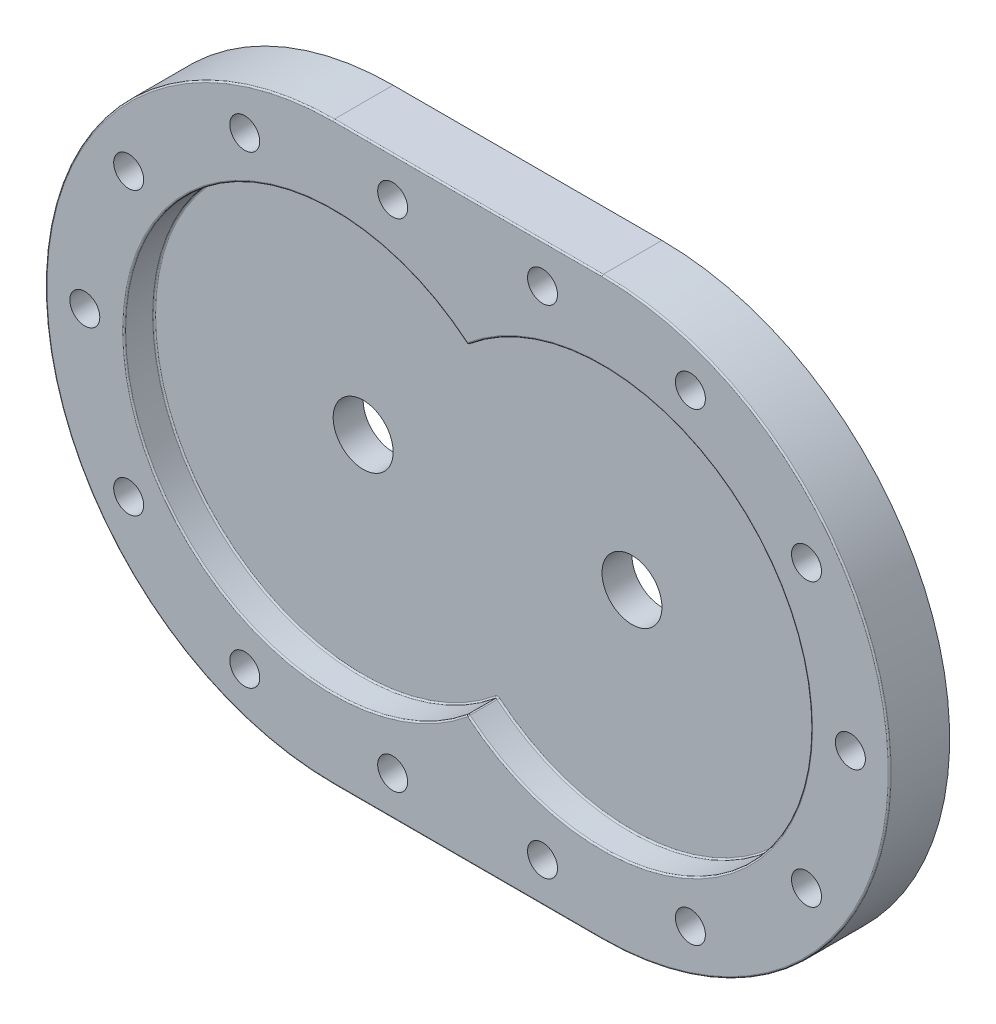
ISO-10303-21;
HEADER;
FILE_DESCRIPTION(('STEP AP214'),'2;1');
FILE_NAME('part.step','',(''),(''),'','','');
FILE_SCHEMA(('AUTOMOTIVE_DESIGN { 1 0 10303 214 1 1 1 1 }'));
ENDSEC;
DATA;
#1=APPLICATION_CONTEXT('core data for automotive mechanical design processes');
#2=APPLICATION_PROTOCOL_DEFINITION('international standard','automotive_design',2000,#1);
#3=PRODUCT_CONTEXT('',#1,'mechanical');
#4=PRODUCT('Part','Part','',(#3));
#5=PRODUCT_RELATED_PRODUCT_CATEGORY('part','',(#4));
#6=PRODUCT_DEFINITION_FORMATION('','',#4);
#7=PRODUCT_DEFINITION_CONTEXT('part definition',#1,'design');
#8=PRODUCT_DEFINITION('design','',#6,#7);
#9=PRODUCT_DEFINITION_SHAPE('','',#8);
#10=(LENGTH_UNIT() NAMED_UNIT(*) SI_UNIT(.MILLI.,.METRE.));
#11=(NAMED_UNIT(*) PLANE_ANGLE_UNIT() SI_UNIT($,.RADIAN.));
#12=(NAMED_UNIT(*) SI_UNIT($,.STERADIAN.) SOLID_ANGLE_UNIT());
#13=UNCERTAINTY_MEASURE_WITH_UNIT(LENGTH_MEASURE(1.E-05),#10,'distance_accuracy_value','');
#14=(GEOMETRIC_REPRESENTATION_CONTEXT(3) GLOBAL_UNCERTAINTY_ASSIGNED_CONTEXT((#13)) GLOBAL_UNIT_ASSIGNED_CONTEXT((#10,
#11,#12)) REPRESENTATION_CONTEXT('',''));
#15=CARTESIAN_POINT('',(0.,0.,0.));
#16=DIRECTION('',(0.,0.,1.));
#17=DIRECTION('',(1.,0.,0.));
#18=AXIS2_PLACEMENT_3D('',#15,#16,#17);
#19=CARTESIAN_POINT('',(0.,-96.,20.));
#20=DIRECTION('',(0.,1.,0.));
#21=DIRECTION('',(-1.,0.,0.));
#22=AXIS2_PLACEMENT_3D('',#19,#20,#21);
#23=PLANE('',#22);
#24=DIRECTION('',(0.,0.,-1.));
#25=VECTOR('',#24,1.);
#26=CARTESIAN_POINT('',(44.845,-96.,20.));
#27=LINE('',#26,#25);
#28=CARTESIAN_POINT('',(44.845,-96.,19.5));
#29=VERTEX_POINT('',#28);
#30=CARTESIAN_POINT('',(44.845,-96.,0.));
#31=VERTEX_POINT('',#30);
#32=EDGE_CURVE('E163',#29,#31,#27,.T.);
#33=ORIENTED_EDGE('',*,*,#32,.F.);
#34=DIRECTION('',(1.,0.,0.));
#35=VECTOR('',#34,1.);
#36=CARTESIAN_POINT('',(-44.845,-96.,19.5));
#37=LINE('',#36,#35);
#38=CARTESIAN_POINT('',(-44.845,-96.,19.5));
#39=VERTEX_POINT('',#38);
#40=EDGE_CURVE('E218',#29,#39,#37,.F.);
#41=ORIENTED_EDGE('',*,*,#40,.T.);
#42=DIRECTION('',(0.,0.,-1.));
#43=VECTOR('',#42,1.);
#44=CARTESIAN_POINT('',(-44.845,-96.,20.));
#45=LINE('',#44,#43);
#46=CARTESIAN_POINT('',(-44.845,-96.,0.));
#47=VERTEX_POINT('',#46);
#48=EDGE_CURVE('E187',#39,#47,#45,.T.);
#49=ORIENTED_EDGE('',*,*,#48,.T.);
#50=DIRECTION('',(1.,0.,0.));
#51=VECTOR('',#50,1.);
#52=CARTESIAN_POINT('',(0.,-96.,0.));
#53=LINE('',#52,#51);
#54=EDGE_CURVE('E182',#47,#31,#53,.T.);
#55=ORIENTED_EDGE('',*,*,#54,.T.);
#56=EDGE_LOOP('',(#33,#41,#49,#55));
#57=FACE_BOUND('',#56,.T.);
#58=ADVANCED_FACE('F68',(#57),#23,.F.);
#59=CARTESIAN_POINT('',(44.845,0.,20.));
#60=DIRECTION('',(0.,0.,-1.));
#61=DIRECTION('',(-1.,0.,0.));
#62=AXIS2_PLACEMENT_3D('',#59,#60,#61);
#63=CYLINDRICAL_SURFACE('',#62,96.);
#64=DIRECTION('',(0.,0.,-1.));
#65=VECTOR('',#64,1.);
#66=CARTESIAN_POINT('',(44.845,96.,20.));
#67=LINE('',#66,#65);
#68=CARTESIAN_POINT('',(44.845,96.,19.5));
#69=VERTEX_POINT('',#68);
#70=CARTESIAN_POINT('',(44.845,96.,0.));
#71=VERTEX_POINT('',#70);
#72=EDGE_CURVE('E175',#69,#71,#67,.T.);
#73=ORIENTED_EDGE('',*,*,#72,.F.);
#74=CARTESIAN_POINT('',(44.845,0.,19.5));
#75=DIRECTION('',(0.,0.,1.));
#76=DIRECTION('',(1.,0.,0.));
#77=AXIS2_PLACEMENT_3D('',#74,#75,#76);
#78=CIRCLE('',#77,96.);
#79=EDGE_CURVE('E13',#69,#29,#78,.F.);
#80=ORIENTED_EDGE('',*,*,#79,.T.);
#81=ORIENTED_EDGE('',*,*,#32,.T.);
#82=CARTESIAN_POINT('',(44.845,0.,0.));
#83=DIRECTION('',(0.,0.,1.));
#84=DIRECTION('',(1.,0.,0.));
#85=AXIS2_PLACEMENT_3D('',#82,#83,#84);
#86=CIRCLE('',#85,96.);
#87=EDGE_CURVE('E167',#31,#71,#86,.T.);
#88=ORIENTED_EDGE('',*,*,#87,.T.);
#89=EDGE_LOOP('',(#73,#80,#81,#88));
#90=FACE_BOUND('',#89,.T.);
#91=ADVANCED_FACE('F166',(#90),#63,.T.);
#92=CARTESIAN_POINT('',(0.,96.,20.));
#93=DIRECTION('',(0.,1.,0.));
#94=DIRECTION('',(-1.,0.,0.));
#95=AXIS2_PLACEMENT_3D('',#92,#93,#94);
#96=PLANE('',#95);
#97=DIRECTION('',(0.,0.,-1.));
#98=VECTOR('',#97,1.);
#99=CARTESIAN_POINT('',(-44.845,96.,20.));
#100=LINE('',#99,#98);
#101=CARTESIAN_POINT('',(-44.845,96.,19.5));
#102=VERTEX_POINT('',#101);
#103=CARTESIAN_POINT('',(-44.845,96.,0.));
#104=VERTEX_POINT('',#103);
#105=EDGE_CURVE('E202',#102,#104,#100,.T.);
#106=ORIENTED_EDGE('',*,*,#105,.F.);
#107=DIRECTION('',(1.,0.,0.));
#108=VECTOR('',#107,1.);
#109=CARTESIAN_POINT('',(0.,96.,19.5));
#110=LINE('',#109,#108);
#111=EDGE_CURVE('E222',#102,#69,#110,.T.);
#112=ORIENTED_EDGE('',*,*,#111,.T.);
#113=ORIENTED_EDGE('',*,*,#72,.T.);
#114=DIRECTION('',(1.,0.,0.));
#115=VECTOR('',#114,1.);
#116=CARTESIAN_POINT('',(0.,96.,0.));
#117=LINE('',#116,#115);
#118=EDGE_CURVE('E184',#104,#71,#117,.T.);
#119=ORIENTED_EDGE('',*,*,#118,.F.);
#120=EDGE_LOOP('',(#106,#112,#113,#119));
#121=FACE_BOUND('',#120,.T.);
#122=ADVANCED_FACE('F435',(#121),#96,.T.);
#123=CARTESIAN_POINT('',(44.845,0.,20.));
#124=DIRECTION('',(0.,0.,-1.));
#125=DIRECTION('',(-1.,0.,0.));
#126=AXIS2_PLACEMENT_3D('',#123,#124,#125);
#127=CYLINDRICAL_SURFACE('',#126,69.75);
#128=CARTESIAN_POINT('',(44.845,0.,10.5));
#129=DIRECTION('',(0.,0.,1.));
#130=DIRECTION('',(1.,0.,0.));
#131=AXIS2_PLACEMENT_3D('',#128,#129,#130);
#132=CIRCLE('',#131,69.75);
#133=CARTESIAN_POINT('',(0.319181494661918,53.6890490363696,10.5));
#134=VERTEX_POINT('',#133);
#135=CARTESIAN_POINT('',(0.319181494661919,-53.6890490363696,10.5));
#136=VERTEX_POINT('',#135);
#137=EDGE_CURVE('E226',#134,#136,#132,.F.);
#138=ORIENTED_EDGE('',*,*,#137,.T.);
#139=DIRECTION('',(0.,0.,-1.));
#140=VECTOR('',#139,1.);
#141=CARTESIAN_POINT('',(0.319181494661917,-53.6890490363695,20.));
#142=LINE('',#141,#140);
#143=CARTESIAN_POINT('',(0.319181494661919,-53.6890490363696,19.5));
#144=VERTEX_POINT('',#143);
#145=EDGE_CURVE('E231',#136,#144,#142,.F.);
#146=ORIENTED_EDGE('',*,*,#145,.T.);
#147=CARTESIAN_POINT('',(44.845,0.,19.5));
#148=DIRECTION('',(0.,0.,1.));
#149=DIRECTION('',(1.,0.,0.));
#150=AXIS2_PLACEMENT_3D('',#147,#148,#149);
#151=CIRCLE('',#150,69.75);
#152=CARTESIAN_POINT('',(0.319181494661918,53.6890490363696,19.5));
#153=VERTEX_POINT('',#152);
#154=EDGE_CURVE('E228',#144,#153,#151,.T.);
#155=ORIENTED_EDGE('',*,*,#154,.T.);
#156=DIRECTION('',(0.,0.,-1.));
#157=VECTOR('',#156,1.);
#158=CARTESIAN_POINT('',(0.319181494661917,53.6890490363695,20.));
#159=LINE('',#158,#157);
#160=EDGE_CURVE('E224',#153,#134,#159,.T.);
#161=ORIENTED_EDGE('',*,*,#160,.T.);
#162=EDGE_LOOP('',(#138,#146,#155,#161));
#163=FACE_BOUND('',#162,.T.);
#164=ADVANCED_FACE('F319',(#163),#127,.F.);
#165=CARTESIAN_POINT('',(-44.845,0.,20.));
#166=DIRECTION('',(0.,0.,-1.));
#167=DIRECTION('',(-1.,0.,0.));
#168=AXIS2_PLACEMENT_3D('',#165,#166,#167);
#169=CYLINDRICAL_SURFACE('',#168,69.75);
#170=CARTESIAN_POINT('',(-44.845,0.,19.5));
#171=DIRECTION('',(0.,0.,1.));
#172=DIRECTION('',(1.,0.,0.));
#173=AXIS2_PLACEMENT_3D('',#170,#171,#172);
#174=CIRCLE('',#173,69.75);
#175=CARTESIAN_POINT('',(-0.319181494661918,53.6890490363696,19.5));
#176=VERTEX_POINT('',#175);
#177=CARTESIAN_POINT('',(-0.319181494661922,-53.6890490363695,19.5));
#178=VERTEX_POINT('',#177);
#179=EDGE_CURVE('E85',#176,#178,#174,.T.);
#180=ORIENTED_EDGE('',*,*,#179,.T.);
#181=DIRECTION('',(0.,0.,-1.));
#182=VECTOR('',#181,1.);
#183=CARTESIAN_POINT('',(-0.319181494661917,-53.6890490363695,20.));
#184=LINE('',#183,#182);
#185=CARTESIAN_POINT('',(-0.319181494661922,-53.6890490363695,10.5));
#186=VERTEX_POINT('',#185);
#187=EDGE_CURVE('E77',#178,#186,#184,.T.);
#188=ORIENTED_EDGE('',*,*,#187,.T.);
#189=CARTESIAN_POINT('',(-44.845,0.,10.5));
#190=DIRECTION('',(0.,0.,1.));
#191=DIRECTION('',(1.,0.,0.));
#192=AXIS2_PLACEMENT_3D('',#189,#190,#191);
#193=CIRCLE('',#192,69.75);
#194=CARTESIAN_POINT('',(-0.319181494661918,53.6890490363696,10.5));
#195=VERTEX_POINT('',#194);
#196=EDGE_CURVE('E243',#186,#195,#193,.F.);
#197=ORIENTED_EDGE('',*,*,#196,.T.);
#198=DIRECTION('',(0.,0.,-1.));
#199=VECTOR('',#198,1.);
#200=CARTESIAN_POINT('',(-0.319181494661917,53.6890490363695,20.));
#201=LINE('',#200,#199);
#202=EDGE_CURVE('E90',#195,#176,#201,.F.);
#203=ORIENTED_EDGE('',*,*,#202,.T.);
#204=EDGE_LOOP('',(#180,#188,#197,#203));
#205=FACE_BOUND('',#204,.T.);
#206=ADVANCED_FACE('F300',(#205),#169,.F.);
#207=CARTESIAN_POINT('',(-44.845,0.,20.));
#208=DIRECTION('',(0.,0.,-1.));
#209=DIRECTION('',(-1.,0.,0.));
#210=AXIS2_PLACEMENT_3D('',#207,#208,#209);
#211=CYLINDRICAL_SURFACE('',#210,96.);
#212=ORIENTED_EDGE('',*,*,#48,.F.);
#213=CARTESIAN_POINT('',(-44.845,0.,19.5));
#214=DIRECTION('',(0.,0.,1.));
#215=DIRECTION('',(1.,0.,0.));
#216=AXIS2_PLACEMENT_3D('',#213,#214,#215);
#217=CIRCLE('',#216,96.);
#218=EDGE_CURVE('E220',#39,#102,#217,.F.);
#219=ORIENTED_EDGE('',*,*,#218,.T.);
#220=ORIENTED_EDGE('',*,*,#105,.T.);
#221=CARTESIAN_POINT('',(-44.845,0.,0.));
#222=DIRECTION('',(0.,0.,1.));
#223=DIRECTION('',(1.,0.,0.));
#224=AXIS2_PLACEMENT_3D('',#221,#222,#223);
#225=CIRCLE('',#224,96.);
#226=EDGE_CURVE('E199',#104,#47,#225,.T.);
#227=ORIENTED_EDGE('',*,*,#226,.T.);
#228=EDGE_LOOP('',(#212,#219,#220,#227));
#229=FACE_BOUND('',#228,.T.);
#230=ADVANCED_FACE('F338',(#229),#211,.T.);
#231=CARTESIAN_POINT('',(0.,0.,20.));
#232=DIRECTION('',(0.,0.,1.));
#233=DIRECTION('',(1.,0.,0.));
#234=AXIS2_PLACEMENT_3D('',#231,#232,#233);
#235=PLANE('',#234);
#236=CARTESIAN_POINT('',(-44.845,0.,20.));
#237=DIRECTION('',(0.,0.,1.));
#238=DIRECTION('',(1.,0.,0.));
#239=AXIS2_PLACEMENT_3D('',#236,#237,#238);
#240=CIRCLE('',#239,70.25);
#241=CARTESIAN_POINT('',(0.,-54.0739167713973,20.));
#242=VERTEX_POINT('',#241);
#243=CARTESIAN_POINT('',(0.,54.0739167713973,20.));
#244=VERTEX_POINT('',#243);
#245=EDGE_CURVE('E213',#242,#244,#240,.F.);
#246=ORIENTED_EDGE('',*,*,#245,.T.);
#247=CARTESIAN_POINT('',(44.845,0.,20.));
#248=DIRECTION('',(0.,0.,1.));
#249=DIRECTION('',(1.,0.,0.));
#250=AXIS2_PLACEMENT_3D('',#247,#248,#249);
#251=CIRCLE('',#250,70.25);
#252=EDGE_CURVE('E215',#244,#242,#251,.F.);
#253=ORIENTED_EDGE('',*,*,#252,.T.);
#254=EDGE_LOOP('',(#246,#253));
#255=FACE_BOUND('',#254,.T.);
#256=CARTESIAN_POINT('',(-44.845,0.,20.));
#257=DIRECTION('',(0.,0.,1.));
#258=DIRECTION('',(1.,0.,0.));
#259=AXIS2_PLACEMENT_3D('',#256,#257,#258);
#260=CIRCLE('',#259,95.5);
#261=CARTESIAN_POINT('',(-44.845,95.5,20.));
#262=VERTEX_POINT('',#261);
#263=CARTESIAN_POINT('',(-44.845,-95.5,20.));
#264=VERTEX_POINT('',#263);
#265=EDGE_CURVE('E208',#262,#264,#260,.T.);
#266=ORIENTED_EDGE('',*,*,#265,.T.);
#267=DIRECTION('',(1.,0.,0.));
#268=VECTOR('',#267,1.);
#269=CARTESIAN_POINT('',(44.845,-95.5,20.));
#270=LINE('',#269,#268);
#271=CARTESIAN_POINT('',(44.845,-95.5,20.));
#272=VERTEX_POINT('',#271);
#273=EDGE_CURVE('E210',#264,#272,#270,.T.);
#274=ORIENTED_EDGE('',*,*,#273,.T.);
#275=CARTESIAN_POINT('',(44.845,0.,20.));
#276=DIRECTION('',(0.,0.,1.));
#277=DIRECTION('',(1.,0.,0.));
#278=AXIS2_PLACEMENT_3D('',#275,#276,#277);
#279=CIRCLE('',#278,95.5);
#280=CARTESIAN_POINT('',(44.845,95.5,20.));
#281=VERTEX_POINT('',#280);
#282=EDGE_CURVE('E174',#272,#281,#279,.T.);
#283=ORIENTED_EDGE('',*,*,#282,.T.);
#284=DIRECTION('',(1.,0.,0.));
#285=VECTOR('',#284,1.);
#286=CARTESIAN_POINT('',(0.,95.5,20.));
#287=LINE('',#286,#285);
#288=EDGE_CURVE('E206',#281,#262,#287,.F.);
#289=ORIENTED_EDGE('',*,*,#288,.T.);
#290=EDGE_LOOP('',(#266,#274,#283,#289));
#291=FACE_BOUND('',#290,.T.);
#292=CARTESIAN_POINT('',(113.085024418063,-47.0272760472282,20.));
#293=DIRECTION('',(0.,0.,1.));
#294=DIRECTION('',(1.,0.,0.));
#295=AXIS2_PLACEMENT_3D('',#292,#293,#294);
#296=CIRCLE('',#295,4.99999999999999);
#297=CARTESIAN_POINT('',(118.085024418063,-47.0272760472282,20.));
#298=VERTEX_POINT('',#297);
#299=EDGE_CURVE('E258',#298,#298,#296,.T.);
#300=ORIENTED_EDGE('',*,*,#299,.F.);
#301=EDGE_LOOP('',(#300));
#302=FACE_BOUND('',#301,.T.);
#303=CARTESIAN_POINT('',(74.348906366885,-77.4453687065539,20.));
#304=DIRECTION('',(0.,0.,1.));
#305=DIRECTION('',(1.,0.,0.));
#306=AXIS2_PLACEMENT_3D('',#303,#304,#305);
#307=CIRCLE('',#306,4.99999999999999);
#308=CARTESIAN_POINT('',(79.348906366885,-77.4453687065539,20.));
#309=VERTEX_POINT('',#308);
#310=EDGE_CURVE('E349',#309,#309,#307,.T.);
#311=ORIENTED_EDGE('',*,*,#310,.F.);
#312=EDGE_LOOP('',(#311));
#313=FACE_BOUND('',#312,.T.);
#314=CARTESIAN_POINT('',(25.0035350833038,-82.875,20.));
#315=DIRECTION('',(0.,0.,1.));
#316=DIRECTION('',(1.,0.,0.));
#317=AXIS2_PLACEMENT_3D('',#314,#315,#316);
#318=CIRCLE('',#317,4.99999999999999);
#319=CARTESIAN_POINT('',(30.0035350833038,-82.875,20.));
#320=VERTEX_POINT('',#319);
#321=EDGE_CURVE('E353',#320,#320,#318,.T.);
#322=ORIENTED_EDGE('',*,*,#321,.F.);
#323=EDGE_LOOP('',(#322));
#324=FACE_BOUND('',#323,.T.);
#325=CARTESIAN_POINT('',(-25.0035350833039,-82.8750000000001,20.));
#326=DIRECTION('',(0.,0.,1.));
#327=DIRECTION('',(1.,0.,0.));
#328=AXIS2_PLACEMENT_3D('',#325,#326,#327);
#329=CIRCLE('',#328,4.99999999999999);
#330=CARTESIAN_POINT('',(-20.003535083304,-82.8750000000001,20.));
#331=VERTEX_POINT('',#330);
#332=EDGE_CURVE('E357',#331,#331,#329,.T.);
#333=ORIENTED_EDGE('',*,*,#332,.F.);
#334=EDGE_LOOP('',(#333));
#335=FACE_BOUND('',#334,.T.);
#336=CARTESIAN_POINT('',(-74.3489063668852,-77.4453687065539,20.));
#337=DIRECTION('',(0.,0.,1.));
#338=DIRECTION('',(1.,0.,0.));
#339=AXIS2_PLACEMENT_3D('',#336,#337,#338);
#340=CIRCLE('',#339,4.99999999999999);
#341=CARTESIAN_POINT('',(-69.3489063668852,-77.4453687065539,20.));
#342=VERTEX_POINT('',#341);
#343=EDGE_CURVE('E361',#342,#342,#340,.T.);
#344=ORIENTED_EDGE('',*,*,#343,.F.);
#345=EDGE_LOOP('',(#344));
#346=FACE_BOUND('',#345,.T.);
#347=CARTESIAN_POINT('',(-113.085024418063,-47.0272760472281,20.));
#348=DIRECTION('',(0.,0.,1.));
#349=DIRECTION('',(1.,0.,0.));
#350=AXIS2_PLACEMENT_3D('',#347,#348,#349);
#351=CIRCLE('',#350,4.99999999999999);
#352=CARTESIAN_POINT('',(-108.085024418063,-47.0272760472281,20.));
#353=VERTEX_POINT('',#352);
#354=EDGE_CURVE('E365',#353,#353,#351,.T.);
#355=ORIENTED_EDGE('',*,*,#354,.F.);
#356=EDGE_LOOP('',(#355));
#357=FACE_BOUND('',#356,.T.);
#358=CARTESIAN_POINT('',(-127.72,0.,20.));
#359=DIRECTION('',(0.,0.,1.));
#360=DIRECTION('',(1.,0.,0.));
#361=AXIS2_PLACEMENT_3D('',#358,#359,#360);
#362=CIRCLE('',#361,4.99999999999999);
#363=CARTESIAN_POINT('',(-122.72,0.,20.));
#364=VERTEX_POINT('',#363);
#365=EDGE_CURVE('E369',#364,#364,#362,.T.);
#366=ORIENTED_EDGE('',*,*,#365,.F.);
#367=EDGE_LOOP('',(#366));
#368=FACE_BOUND('',#367,.T.);
#369=CARTESIAN_POINT('',(-113.085024418063,47.0272760472283,20.));
#370=DIRECTION('',(0.,0.,1.));
#371=DIRECTION('',(1.,0.,0.));
#372=AXIS2_PLACEMENT_3D('',#369,#370,#371);
#373=CIRCLE('',#372,4.99999999999999);
#374=CARTESIAN_POINT('',(-108.085024418063,47.0272760472283,20.));
#375=VERTEX_POINT('',#374);
#376=EDGE_CURVE('E373',#375,#375,#373,.T.);
#377=ORIENTED_EDGE('',*,*,#376,.F.);
#378=EDGE_LOOP('',(#377));
#379=FACE_BOUND('',#378,.T.);
#380=CARTESIAN_POINT('',(-74.348906366885,77.445368706554,20.));
#381=DIRECTION('',(0.,0.,1.));
#382=DIRECTION('',(1.,0.,0.));
#383=AXIS2_PLACEMENT_3D('',#380,#381,#382);
#384=CIRCLE('',#383,4.99999999999999);
#385=CARTESIAN_POINT('',(-69.348906366885,77.445368706554,20.));
#386=VERTEX_POINT('',#385);
#387=EDGE_CURVE('E377',#386,#386,#384,.T.);
#388=ORIENTED_EDGE('',*,*,#387,.F.);
#389=EDGE_LOOP('',(#388));
#390=FACE_BOUND('',#389,.T.);
#391=CARTESIAN_POINT('',(-25.0035350833038,82.875,20.));
#392=DIRECTION('',(0.,0.,1.));
#393=DIRECTION('',(1.,0.,0.));
#394=AXIS2_PLACEMENT_3D('',#391,#392,#393);
#395=CIRCLE('',#394,4.99999999999999);
#396=CARTESIAN_POINT('',(-20.0035350833038,82.875,20.));
#397=VERTEX_POINT('',#396);
#398=EDGE_CURVE('E381',#397,#397,#395,.T.);
#399=ORIENTED_EDGE('',*,*,#398,.F.);
#400=EDGE_LOOP('',(#399));
#401=FACE_BOUND('',#400,.T.);
#402=CARTESIAN_POINT('',(25.0035350833039,82.875,20.));
#403=DIRECTION('',(0.,0.,1.));
#404=DIRECTION('',(1.,0.,0.));
#405=AXIS2_PLACEMENT_3D('',#402,#403,#404);
#406=CIRCLE('',#405,4.99999999999999);
#407=CARTESIAN_POINT('',(30.0035350833039,82.875,20.));
#408=VERTEX_POINT('',#407);
#409=EDGE_CURVE('E385',#408,#408,#406,.T.);
#410=ORIENTED_EDGE('',*,*,#409,.F.);
#411=EDGE_LOOP('',(#410));
#412=FACE_BOUND('',#411,.T.);
#413=CARTESIAN_POINT('',(74.3489063668851,77.4453687065539,20.));
#414=DIRECTION('',(0.,0.,1.));
#415=DIRECTION('',(1.,0.,0.));
#416=AXIS2_PLACEMENT_3D('',#413,#414,#415);
#417=CIRCLE('',#416,4.99999999999999);
#418=CARTESIAN_POINT('',(79.3489063668851,77.4453687065539,20.));
#419=VERTEX_POINT('',#418);
#420=EDGE_CURVE('E389',#419,#419,#417,.T.);
#421=ORIENTED_EDGE('',*,*,#420,.F.);
#422=EDGE_LOOP('',(#421));
#423=FACE_BOUND('',#422,.T.);
#424=CARTESIAN_POINT('',(113.085024418063,47.0272760472282,20.));
#425=DIRECTION('',(0.,0.,1.));
#426=DIRECTION('',(1.,0.,0.));
#427=AXIS2_PLACEMENT_3D('',#424,#425,#426);
#428=CIRCLE('',#427,4.99999999999999);
#429=CARTESIAN_POINT('',(118.085024418063,47.0272760472282,20.));
#430=VERTEX_POINT('',#429);
#431=EDGE_CURVE('E393',#430,#430,#428,.T.);
#432=ORIENTED_EDGE('',*,*,#431,.F.);
#433=EDGE_LOOP('',(#432));
#434=FACE_BOUND('',#433,.T.);
#435=CARTESIAN_POINT('',(127.72,0.,20.));
#436=DIRECTION('',(0.,0.,1.));
#437=DIRECTION('',(1.,0.,0.));
#438=AXIS2_PLACEMENT_3D('',#435,#436,#437);
#439=CIRCLE('',#438,4.99999999999998);
#440=CARTESIAN_POINT('',(132.72,0.,20.));
#441=VERTEX_POINT('',#440);
#442=EDGE_CURVE('E396',#441,#441,#439,.T.);
#443=ORIENTED_EDGE('',*,*,#442,.F.);
#444=EDGE_LOOP('',(#443));
#445=FACE_BOUND('',#444,.T.);
#446=ADVANCED_FACE('F335',(#255,#291,#302,#313,#324,#335,#346,#357,#368,#379,#390,#401,#412,
#423,#434,#445),#235,.T.);
#447=CARTESIAN_POINT('',(0.,0.,0.));
#448=DIRECTION('',(0.,0.,1.));
#449=DIRECTION('',(1.,0.,0.));
#450=AXIS2_PLACEMENT_3D('',#447,#448,#449);
#451=PLANE('',#450);
#452=CARTESIAN_POINT('',(113.085024418063,-47.0272760472282,0.));
#453=DIRECTION('',(0.,0.,1.));
#454=DIRECTION('',(1.,0.,0.));
#455=AXIS2_PLACEMENT_3D('',#452,#453,#454);
#456=CIRCLE('',#455,4.99999999999999);
#457=CARTESIAN_POINT('',(118.085024418063,-47.0272760472282,0.));
#458=VERTEX_POINT('',#457);
#459=EDGE_CURVE('E834',#458,#458,#456,.T.);
#460=ORIENTED_EDGE('',*,*,#459,.T.);
#461=EDGE_LOOP('',(#460));
#462=FACE_BOUND('',#461,.T.);
#463=CARTESIAN_POINT('',(74.348906366885,-77.4453687065539,0.));
#464=DIRECTION('',(0.,0.,1.));
#465=DIRECTION('',(1.,0.,0.));
#466=AXIS2_PLACEMENT_3D('',#463,#464,#465);
#467=CIRCLE('',#466,4.99999999999999);
#468=CARTESIAN_POINT('',(79.348906366885,-77.4453687065539,0.));
#469=VERTEX_POINT('',#468);
#470=EDGE_CURVE('E830',#469,#469,#467,.T.);
#471=ORIENTED_EDGE('',*,*,#470,.T.);
#472=EDGE_LOOP('',(#471));
#473=FACE_BOUND('',#472,.T.);
#474=CARTESIAN_POINT('',(25.0035350833038,-82.875,0.));
#475=DIRECTION('',(0.,0.,1.));
#476=DIRECTION('',(1.,0.,0.));
#477=AXIS2_PLACEMENT_3D('',#474,#475,#476);
#478=CIRCLE('',#477,4.99999999999999);
#479=CARTESIAN_POINT('',(30.0035350833038,-82.875,0.));
#480=VERTEX_POINT('',#479);
#481=EDGE_CURVE('E826',#480,#480,#478,.T.);
#482=ORIENTED_EDGE('',*,*,#481,.T.);
#483=EDGE_LOOP('',(#482));
#484=FACE_BOUND('',#483,.T.);
#485=CARTESIAN_POINT('',(-25.0035350833039,-82.8750000000001,0.));
#486=DIRECTION('',(0.,0.,1.));
#487=DIRECTION('',(1.,0.,0.));
#488=AXIS2_PLACEMENT_3D('',#485,#486,#487);
#489=CIRCLE('',#488,4.99999999999999);
#490=CARTESIAN_POINT('',(-20.003535083304,-82.8750000000001,0.));
#491=VERTEX_POINT('',#490);
#492=EDGE_CURVE('E822',#491,#491,#489,.T.);
#493=ORIENTED_EDGE('',*,*,#492,.T.);
#494=EDGE_LOOP('',(#493));
#495=FACE_BOUND('',#494,.T.);
#496=CARTESIAN_POINT('',(-74.3489063668852,-77.4453687065539,0.));
#497=DIRECTION('',(0.,0.,1.));
#498=DIRECTION('',(1.,0.,0.));
#499=AXIS2_PLACEMENT_3D('',#496,#497,#498);
#500=CIRCLE('',#499,4.99999999999999);
#501=CARTESIAN_POINT('',(-69.3489063668852,-77.4453687065539,0.));
#502=VERTEX_POINT('',#501);
#503=EDGE_CURVE('E818',#502,#502,#500,.T.);
#504=ORIENTED_EDGE('',*,*,#503,.T.);
#505=EDGE_LOOP('',(#504));
#506=FACE_BOUND('',#505,.T.);
#507=CARTESIAN_POINT('',(-113.085024418063,-47.0272760472281,0.));
#508=DIRECTION('',(0.,0.,1.));
#509=DIRECTION('',(1.,0.,0.));
#510=AXIS2_PLACEMENT_3D('',#507,#508,#509);
#511=CIRCLE('',#510,4.99999999999999);
#512=CARTESIAN_POINT('',(-108.085024418063,-47.0272760472281,0.));
#513=VERTEX_POINT('',#512);
#514=EDGE_CURVE('E814',#513,#513,#511,.T.);
#515=ORIENTED_EDGE('',*,*,#514,.T.);
#516=EDGE_LOOP('',(#515));
#517=FACE_BOUND('',#516,.T.);
#518=CARTESIAN_POINT('',(-127.72,0.,0.));
#519=DIRECTION('',(0.,0.,1.));
#520=DIRECTION('',(1.,0.,0.));
#521=AXIS2_PLACEMENT_3D('',#518,#519,#520);
#522=CIRCLE('',#521,4.99999999999999);
#523=CARTESIAN_POINT('',(-122.72,0.,0.));
#524=VERTEX_POINT('',#523);
#525=EDGE_CURVE('E810',#524,#524,#522,.T.);
#526=ORIENTED_EDGE('',*,*,#525,.T.);
#527=EDGE_LOOP('',(#526));
#528=FACE_BOUND('',#527,.T.);
#529=CARTESIAN_POINT('',(-113.085024418063,47.0272760472283,0.));
#530=DIRECTION('',(0.,0.,1.));
#531=DIRECTION('',(1.,0.,0.));
#532=AXIS2_PLACEMENT_3D('',#529,#530,#531);
#533=CIRCLE('',#532,4.99999999999999);
#534=CARTESIAN_POINT('',(-108.085024418063,47.0272760472283,0.));
#535=VERTEX_POINT('',#534);
#536=EDGE_CURVE('E806',#535,#535,#533,.T.);
#537=ORIENTED_EDGE('',*,*,#536,.T.);
#538=EDGE_LOOP('',(#537));
#539=FACE_BOUND('',#538,.T.);
#540=CARTESIAN_POINT('',(-74.348906366885,77.445368706554,0.));
#541=DIRECTION('',(0.,0.,1.));
#542=DIRECTION('',(1.,0.,0.));
#543=AXIS2_PLACEMENT_3D('',#540,#541,#542);
#544=CIRCLE('',#543,4.99999999999999);
#545=CARTESIAN_POINT('',(-69.348906366885,77.445368706554,0.));
#546=VERTEX_POINT('',#545);
#547=EDGE_CURVE('E802',#546,#546,#544,.T.);
#548=ORIENTED_EDGE('',*,*,#547,.T.);
#549=EDGE_LOOP('',(#548));
#550=FACE_BOUND('',#549,.T.);
#551=CARTESIAN_POINT('',(-25.0035350833038,82.875,0.));
#552=DIRECTION('',(0.,0.,1.));
#553=DIRECTION('',(1.,0.,0.));
#554=AXIS2_PLACEMENT_3D('',#551,#552,#553);
#555=CIRCLE('',#554,4.99999999999999);
#556=CARTESIAN_POINT('',(-20.0035350833038,82.875,0.));
#557=VERTEX_POINT('',#556);
#558=EDGE_CURVE('E798',#557,#557,#555,.T.);
#559=ORIENTED_EDGE('',*,*,#558,.T.);
#560=EDGE_LOOP('',(#559));
#561=FACE_BOUND('',#560,.T.);
#562=CARTESIAN_POINT('',(25.0035350833039,82.875,0.));
#563=DIRECTION('',(0.,0.,1.));
#564=DIRECTION('',(1.,0.,0.));
#565=AXIS2_PLACEMENT_3D('',#562,#563,#564);
#566=CIRCLE('',#565,4.99999999999999);
#567=CARTESIAN_POINT('',(30.0035350833039,82.875,0.));
#568=VERTEX_POINT('',#567);
#569=EDGE_CURVE('E794',#568,#568,#566,.T.);
#570=ORIENTED_EDGE('',*,*,#569,.T.);
#571=EDGE_LOOP('',(#570));
#572=FACE_BOUND('',#571,.T.);
#573=CARTESIAN_POINT('',(74.3489063668851,77.4453687065539,0.));
#574=DIRECTION('',(0.,0.,1.));
#575=DIRECTION('',(1.,0.,0.));
#576=AXIS2_PLACEMENT_3D('',#573,#574,#575);
#577=CIRCLE('',#576,4.99999999999999);
#578=CARTESIAN_POINT('',(79.3489063668851,77.4453687065539,0.));
#579=VERTEX_POINT('',#578);
#580=EDGE_CURVE('E789',#579,#579,#577,.T.);
#581=ORIENTED_EDGE('',*,*,#580,.T.);
#582=EDGE_LOOP('',(#581));
#583=FACE_BOUND('',#582,.T.);
#584=CARTESIAN_POINT('',(113.085024418063,47.0272760472282,0.));
#585=DIRECTION('',(0.,0.,1.));
#586=DIRECTION('',(1.,0.,0.));
#587=AXIS2_PLACEMENT_3D('',#584,#585,#586);
#588=CIRCLE('',#587,4.99999999999999);
#589=CARTESIAN_POINT('',(118.085024418063,47.0272760472282,0.));
#590=VERTEX_POINT('',#589);
#591=EDGE_CURVE('E399',#590,#590,#588,.T.);
#592=ORIENTED_EDGE('',*,*,#591,.T.);
#593=EDGE_LOOP('',(#592));
#594=FACE_BOUND('',#593,.T.);
#595=CARTESIAN_POINT('',(127.72,0.,0.));
#596=DIRECTION('',(0.,0.,1.));
#597=DIRECTION('',(1.,0.,0.));
#598=AXIS2_PLACEMENT_3D('',#595,#596,#597);
#599=CIRCLE('',#598,4.99999999999999);
#600=CARTESIAN_POINT('',(132.72,0.,0.));
#601=VERTEX_POINT('',#600);
#602=EDGE_CURVE('E398',#601,#601,#599,.T.);
#603=ORIENTED_EDGE('',*,*,#602,.T.);
#604=EDGE_LOOP('',(#603));
#605=FACE_BOUND('',#604,.T.);
#606=ORIENTED_EDGE('',*,*,#54,.F.);
#607=ORIENTED_EDGE('',*,*,#226,.F.);
#608=ORIENTED_EDGE('',*,*,#118,.T.);
#609=ORIENTED_EDGE('',*,*,#87,.F.);
#610=EDGE_LOOP('',(#606,#607,#608,#609));
#611=FACE_BOUND('',#610,.T.);
#612=CARTESIAN_POINT('',(44.845,0.,0.));
#613=DIRECTION('',(0.,0.,1.));
#614=DIRECTION('',(1.,0.,0.));
#615=AXIS2_PLACEMENT_3D('',#612,#613,#614);
#616=CIRCLE('',#615,10.);
#617=CARTESIAN_POINT('',(54.845,0.,0.));
#618=VERTEX_POINT('',#617);
#619=EDGE_CURVE('E402',#618,#618,#616,.T.);
#620=ORIENTED_EDGE('',*,*,#619,.T.);
#621=EDGE_LOOP('',(#620));
#622=FACE_BOUND('',#621,.T.);
#623=CARTESIAN_POINT('',(-44.845,0.,0.));
#624=DIRECTION('',(0.,0.,1.));
#625=DIRECTION('',(1.,0.,0.));
#626=AXIS2_PLACEMENT_3D('',#623,#624,#625);
#627=CIRCLE('',#626,10.);
#628=CARTESIAN_POINT('',(-34.845,0.,0.));
#629=VERTEX_POINT('',#628);
#630=EDGE_CURVE('E195',#629,#629,#627,.T.);
#631=ORIENTED_EDGE('',*,*,#630,.T.);
#632=EDGE_LOOP('',(#631));
#633=FACE_BOUND('',#632,.T.);
#634=ADVANCED_FACE('F179',(#462,#473,#484,#495,#506,#517,#528,#539,#550,#561,#572,#583,#594,
#605,#611,#622,#633),#451,.F.);
#635=CARTESIAN_POINT('',(-44.845,0.,10.));
#636=DIRECTION('',(0.,0.,-1.));
#637=DIRECTION('',(-1.,0.,0.));
#638=AXIS2_PLACEMENT_3D('',#635,#636,#637);
#639=CYLINDRICAL_SURFACE('',#638,10.);
#640=CARTESIAN_POINT('',(-44.845,0.,10.));
#641=DIRECTION('',(0.,0.,1.));
#642=DIRECTION('',(1.,0.,0.));
#643=AXIS2_PLACEMENT_3D('',#640,#641,#642);
#644=CIRCLE('',#643,10.);
#645=CARTESIAN_POINT('',(-34.845,0.,10.));
#646=VERTEX_POINT('',#645);
#647=EDGE_CURVE('E189',#646,#646,#644,.T.);
#648=ORIENTED_EDGE('',*,*,#647,.T.);
#649=EDGE_LOOP('',(#648));
#650=FACE_BOUND('',#649,.T.);
#651=ORIENTED_EDGE('',*,*,#630,.F.);
#652=EDGE_LOOP('',(#651));
#653=FACE_BOUND('',#652,.T.);
#654=ADVANCED_FACE('F415',(#650,#653),#639,.F.);
#655=CARTESIAN_POINT('',(44.845,0.,10.));
#656=DIRECTION('',(0.,0.,-1.));
#657=DIRECTION('',(-1.,0.,0.));
#658=AXIS2_PLACEMENT_3D('',#655,#656,#657);
#659=CYLINDRICAL_SURFACE('',#658,10.);
#660=CARTESIAN_POINT('',(44.845,0.,10.));
#661=DIRECTION('',(0.,0.,1.));
#662=DIRECTION('',(1.,0.,0.));
#663=AXIS2_PLACEMENT_3D('',#660,#661,#662);
#664=CIRCLE('',#663,10.);
#665=CARTESIAN_POINT('',(54.845,0.,10.));
#666=VERTEX_POINT('',#665);
#667=EDGE_CURVE('E192',#666,#666,#664,.T.);
#668=ORIENTED_EDGE('',*,*,#667,.T.);
#669=EDGE_LOOP('',(#668));
#670=FACE_BOUND('',#669,.T.);
#671=ORIENTED_EDGE('',*,*,#619,.F.);
#672=EDGE_LOOP('',(#671));
#673=FACE_BOUND('',#672,.T.);
#674=ADVANCED_FACE('F417',(#670,#673),#659,.F.);
#675=CARTESIAN_POINT('',(0.,0.,10.));
#676=DIRECTION('',(0.,0.,1.));
#677=DIRECTION('',(1.,0.,0.));
#678=AXIS2_PLACEMENT_3D('',#675,#676,#677);
#679=PLANE('',#678);
#680=CARTESIAN_POINT('',(0.,-54.0739167713973,10.));
#681=DIRECTION('',(0.,0.,1.));
#682=DIRECTION('',(1.,0.,0.));
#683=AXIS2_PLACEMENT_3D('',#680,#681,#682);
#684=CIRCLE('',#683,1.);
#685=CARTESIAN_POINT('',(0.638362989323841,-53.3041813013418,10.));
#686=VERTEX_POINT('',#685);
#687=CARTESIAN_POINT('',(-0.638362989323843,-53.3041813013418,10.));
#688=VERTEX_POINT('',#687);
#689=EDGE_CURVE('E233',#686,#688,#684,.T.);
#690=ORIENTED_EDGE('',*,*,#689,.F.);
#691=CARTESIAN_POINT('',(44.845,0.,10.));
#692=DIRECTION('',(0.,0.,1.));
#693=DIRECTION('',(1.,0.,0.));
#694=AXIS2_PLACEMENT_3D('',#691,#692,#693);
#695=CIRCLE('',#694,69.25);
#696=CARTESIAN_POINT('',(0.638362989323842,53.3041813013418,10.));
#697=VERTEX_POINT('',#696);
#698=EDGE_CURVE('E240',#686,#697,#695,.T.);
#699=ORIENTED_EDGE('',*,*,#698,.T.);
#700=CARTESIAN_POINT('',(0.,54.0739167713973,10.));
#701=DIRECTION('',(0.,0.,1.));
#702=DIRECTION('',(1.,0.,0.));
#703=AXIS2_PLACEMENT_3D('',#700,#701,#702);
#704=CIRCLE('',#703,1.);
#705=CARTESIAN_POINT('',(-0.63836298932384,53.3041813013418,10.));
#706=VERTEX_POINT('',#705);
#707=EDGE_CURVE('E238',#706,#697,#704,.T.);
#708=ORIENTED_EDGE('',*,*,#707,.F.);
#709=CARTESIAN_POINT('',(-44.845,0.,10.));
#710=DIRECTION('',(0.,0.,1.));
#711=DIRECTION('',(1.,0.,0.));
#712=AXIS2_PLACEMENT_3D('',#709,#710,#711);
#713=CIRCLE('',#712,69.25);
#714=EDGE_CURVE('E236',#706,#688,#713,.T.);
#715=ORIENTED_EDGE('',*,*,#714,.T.);
#716=EDGE_LOOP('',(#690,#699,#708,#715));
#717=FACE_BOUND('',#716,.T.);
#718=ORIENTED_EDGE('',*,*,#667,.F.);
#719=EDGE_LOOP('',(#718));
#720=FACE_BOUND('',#719,.T.);
#721=ORIENTED_EDGE('',*,*,#647,.F.);
#722=EDGE_LOOP('',(#721));
#723=FACE_BOUND('',#722,.T.);
#724=ADVANCED_FACE('F326',(#717,#720,#723),#679,.T.);
#725=CARTESIAN_POINT('',(127.72,0.,20.));
#726=DIRECTION('',(0.,0.,1.));
#727=DIRECTION('',(1.,0.,0.));
#728=AXIS2_PLACEMENT_3D('',#725,#726,#727);
#729=CYLINDRICAL_SURFACE('',#728,4.99999999999999);
#730=ORIENTED_EDGE('',*,*,#602,.F.);
#731=EDGE_LOOP('',(#730));
#732=FACE_BOUND('',#731,.T.);
#733=ORIENTED_EDGE('',*,*,#442,.T.);
#734=EDGE_LOOP('',(#733));
#735=FACE_BOUND('',#734,.T.);
#736=ADVANCED_FACE('F599',(#732,#735),#729,.F.);
#737=CARTESIAN_POINT('',(113.085024418063,47.0272760472282,20.));
#738=DIRECTION('',(0.,0.,1.));
#739=DIRECTION('',(1.,0.,0.));
#740=AXIS2_PLACEMENT_3D('',#737,#738,#739);
#741=CYLINDRICAL_SURFACE('',#740,4.99999999999999);
#742=ORIENTED_EDGE('',*,*,#591,.F.);
#743=EDGE_LOOP('',(#742));
#744=FACE_BOUND('',#743,.T.);
#745=ORIENTED_EDGE('',*,*,#431,.T.);
#746=EDGE_LOOP('',(#745));
#747=FACE_BOUND('',#746,.T.);
#748=ADVANCED_FACE('F591',(#744,#747),#741,.F.);
#749=CARTESIAN_POINT('',(74.3489063668851,77.4453687065539,20.));
#750=DIRECTION('',(0.,0.,1.));
#751=DIRECTION('',(1.,0.,0.));
#752=AXIS2_PLACEMENT_3D('',#749,#750,#751);
#753=CYLINDRICAL_SURFACE('',#752,4.99999999999999);
#754=ORIENTED_EDGE('',*,*,#580,.F.);
#755=EDGE_LOOP('',(#754));
#756=FACE_BOUND('',#755,.T.);
#757=ORIENTED_EDGE('',*,*,#420,.T.);
#758=EDGE_LOOP('',(#757));
#759=FACE_BOUND('',#758,.T.);
#760=ADVANCED_FACE('F583',(#756,#759),#753,.F.);
#761=CARTESIAN_POINT('',(25.0035350833039,82.875,20.));
#762=DIRECTION('',(0.,0.,1.));
#763=DIRECTION('',(1.,0.,0.));
#764=AXIS2_PLACEMENT_3D('',#761,#762,#763);
#765=CYLINDRICAL_SURFACE('',#764,4.99999999999999);
#766=ORIENTED_EDGE('',*,*,#569,.F.);
#767=EDGE_LOOP('',(#766));
#768=FACE_BOUND('',#767,.T.);
#769=ORIENTED_EDGE('',*,*,#409,.T.);
#770=EDGE_LOOP('',(#769));
#771=FACE_BOUND('',#770,.T.);
#772=ADVANCED_FACE('F575',(#768,#771),#765,.F.);
#773=CARTESIAN_POINT('',(-25.0035350833038,82.875,20.));
#774=DIRECTION('',(0.,0.,1.));
#775=DIRECTION('',(1.,0.,0.));
#776=AXIS2_PLACEMENT_3D('',#773,#774,#775);
#777=CYLINDRICAL_SURFACE('',#776,4.99999999999999);
#778=ORIENTED_EDGE('',*,*,#558,.F.);
#779=EDGE_LOOP('',(#778));
#780=FACE_BOUND('',#779,.T.);
#781=ORIENTED_EDGE('',*,*,#398,.T.);
#782=EDGE_LOOP('',(#781));
#783=FACE_BOUND('',#782,.T.);
#784=ADVANCED_FACE('F567',(#780,#783),#777,.F.);
#785=CARTESIAN_POINT('',(-74.348906366885,77.445368706554,20.));
#786=DIRECTION('',(0.,0.,1.));
#787=DIRECTION('',(1.,0.,0.));
#788=AXIS2_PLACEMENT_3D('',#785,#786,#787);
#789=CYLINDRICAL_SURFACE('',#788,4.99999999999999);
#790=ORIENTED_EDGE('',*,*,#547,.F.);
#791=EDGE_LOOP('',(#790));
#792=FACE_BOUND('',#791,.T.);
#793=ORIENTED_EDGE('',*,*,#387,.T.);
#794=EDGE_LOOP('',(#793));
#795=FACE_BOUND('',#794,.T.);
#796=ADVANCED_FACE('F559',(#792,#795),#789,.F.);
#797=CARTESIAN_POINT('',(-113.085024418063,47.0272760472283,20.));
#798=DIRECTION('',(0.,0.,1.));
#799=DIRECTION('',(1.,0.,0.));
#800=AXIS2_PLACEMENT_3D('',#797,#798,#799);
#801=CYLINDRICAL_SURFACE('',#800,4.99999999999999);
#802=ORIENTED_EDGE('',*,*,#536,.F.);
#803=EDGE_LOOP('',(#802));
#804=FACE_BOUND('',#803,.T.);
#805=ORIENTED_EDGE('',*,*,#376,.T.);
#806=EDGE_LOOP('',(#805));
#807=FACE_BOUND('',#806,.T.);
#808=ADVANCED_FACE('F551',(#804,#807),#801,.F.);
#809=CARTESIAN_POINT('',(-127.72,0.,20.));
#810=DIRECTION('',(0.,0.,1.));
#811=DIRECTION('',(1.,0.,0.));
#812=AXIS2_PLACEMENT_3D('',#809,#810,#811);
#813=CYLINDRICAL_SURFACE('',#812,4.99999999999999);
#814=ORIENTED_EDGE('',*,*,#525,.F.);
#815=EDGE_LOOP('',(#814));
#816=FACE_BOUND('',#815,.T.);
#817=ORIENTED_EDGE('',*,*,#365,.T.);
#818=EDGE_LOOP('',(#817));
#819=FACE_BOUND('',#818,.T.);
#820=ADVANCED_FACE('F543',(#816,#819),#813,.F.);
#821=CARTESIAN_POINT('',(-113.085024418063,-47.0272760472281,20.));
#822=DIRECTION('',(0.,0.,1.));
#823=DIRECTION('',(1.,0.,0.));
#824=AXIS2_PLACEMENT_3D('',#821,#822,#823);
#825=CYLINDRICAL_SURFACE('',#824,4.99999999999999);
#826=ORIENTED_EDGE('',*,*,#514,.F.);
#827=EDGE_LOOP('',(#826));
#828=FACE_BOUND('',#827,.T.);
#829=ORIENTED_EDGE('',*,*,#354,.T.);
#830=EDGE_LOOP('',(#829));
#831=FACE_BOUND('',#830,.T.);
#832=ADVANCED_FACE('F535',(#828,#831),#825,.F.);
#833=CARTESIAN_POINT('',(-74.3489063668852,-77.4453687065539,20.));
#834=DIRECTION('',(0.,0.,1.));
#835=DIRECTION('',(1.,0.,0.));
#836=AXIS2_PLACEMENT_3D('',#833,#834,#835);
#837=CYLINDRICAL_SURFACE('',#836,4.99999999999999);
#838=ORIENTED_EDGE('',*,*,#503,.F.);
#839=EDGE_LOOP('',(#838));
#840=FACE_BOUND('',#839,.T.);
#841=ORIENTED_EDGE('',*,*,#343,.T.);
#842=EDGE_LOOP('',(#841));
#843=FACE_BOUND('',#842,.T.);
#844=ADVANCED_FACE('F527',(#840,#843),#837,.F.);
#845=CARTESIAN_POINT('',(-25.0035350833039,-82.8750000000001,20.));
#846=DIRECTION('',(0.,0.,1.));
#847=DIRECTION('',(1.,0.,0.));
#848=AXIS2_PLACEMENT_3D('',#845,#846,#847);
#849=CYLINDRICAL_SURFACE('',#848,4.99999999999999);
#850=ORIENTED_EDGE('',*,*,#492,.F.);
#851=EDGE_LOOP('',(#850));
#852=FACE_BOUND('',#851,.T.);
#853=ORIENTED_EDGE('',*,*,#332,.T.);
#854=EDGE_LOOP('',(#853));
#855=FACE_BOUND('',#854,.T.);
#856=ADVANCED_FACE('F519',(#852,#855),#849,.F.);
#857=CARTESIAN_POINT('',(25.0035350833038,-82.875,20.));
#858=DIRECTION('',(0.,0.,1.));
#859=DIRECTION('',(1.,0.,0.));
#860=AXIS2_PLACEMENT_3D('',#857,#858,#859);
#861=CYLINDRICAL_SURFACE('',#860,4.99999999999999);
#862=ORIENTED_EDGE('',*,*,#481,.F.);
#863=EDGE_LOOP('',(#862));
#864=FACE_BOUND('',#863,.T.);
#865=ORIENTED_EDGE('',*,*,#321,.T.);
#866=EDGE_LOOP('',(#865));
#867=FACE_BOUND('',#866,.T.);
#868=ADVANCED_FACE('F511',(#864,#867),#861,.F.);
#869=CARTESIAN_POINT('',(74.348906366885,-77.4453687065539,20.));
#870=DIRECTION('',(0.,0.,1.));
#871=DIRECTION('',(1.,0.,0.));
#872=AXIS2_PLACEMENT_3D('',#869,#870,#871);
#873=CYLINDRICAL_SURFACE('',#872,4.99999999999999);
#874=ORIENTED_EDGE('',*,*,#470,.F.);
#875=EDGE_LOOP('',(#874));
#876=FACE_BOUND('',#875,.T.);
#877=ORIENTED_EDGE('',*,*,#310,.T.);
#878=EDGE_LOOP('',(#877));
#879=FACE_BOUND('',#878,.T.);
#880=ADVANCED_FACE('F503',(#876,#879),#873,.F.);
#881=CARTESIAN_POINT('',(113.085024418063,-47.0272760472282,20.));
#882=DIRECTION('',(0.,0.,1.));
#883=DIRECTION('',(1.,0.,0.));
#884=AXIS2_PLACEMENT_3D('',#881,#882,#883);
#885=CYLINDRICAL_SURFACE('',#884,4.99999999999999);
#886=ORIENTED_EDGE('',*,*,#459,.F.);
#887=EDGE_LOOP('',(#886));
#888=FACE_BOUND('',#887,.T.);
#889=ORIENTED_EDGE('',*,*,#299,.T.);
#890=EDGE_LOOP('',(#889));
#891=FACE_BOUND('',#890,.T.);
#892=ADVANCED_FACE('F458',(#888,#891),#885,.F.);
#893=CARTESIAN_POINT('',(0.,95.5,19.5));
#894=DIRECTION('',(1.,0.,0.));
#895=DIRECTION('',(0.,1.,0.));
#896=AXIS2_PLACEMENT_3D('',#893,#894,#895);
#897=CYLINDRICAL_SURFACE('',#896,0.5);
#898=CARTESIAN_POINT('',(44.845,95.5,19.5));
#899=DIRECTION('',(1.,0.,0.));
#900=DIRECTION('',(0.,0.,-1.));
#901=AXIS2_PLACEMENT_3D('',#898,#899,#900);
#902=CIRCLE('',#901,0.5);
#903=EDGE_CURVE('E252',#69,#281,#902,.T.);
#904=ORIENTED_EDGE('',*,*,#903,.F.);
#905=ORIENTED_EDGE('',*,*,#111,.F.);
#906=CARTESIAN_POINT('',(-44.845,95.5,19.5));
#907=DIRECTION('',(-1.,0.,0.));
#908=DIRECTION('',(0.,0.,1.));
#909=AXIS2_PLACEMENT_3D('',#906,#907,#908);
#910=CIRCLE('',#909,0.5);
#911=EDGE_CURVE('E255',#262,#102,#910,.T.);
#912=ORIENTED_EDGE('',*,*,#911,.F.);
#913=ORIENTED_EDGE('',*,*,#288,.F.);
#914=EDGE_LOOP('',(#904,#905,#912,#913));
#915=FACE_BOUND('',#914,.T.);
#916=ADVANCED_FACE('F454',(#915),#897,.T.);
#917=CARTESIAN_POINT('',(-44.845,0.,19.5));
#918=DIRECTION('',(0.,0.,1.));
#919=DIRECTION('',(1.,0.,0.));
#920=AXIS2_PLACEMENT_3D('',#917,#918,#919);
#921=TOROIDAL_SURFACE('',#920,95.5,0.5);
#922=ORIENTED_EDGE('',*,*,#911,.T.);
#923=ORIENTED_EDGE('',*,*,#218,.F.);
#924=CARTESIAN_POINT('',(-44.845,-95.5,19.5));
#925=DIRECTION('',(1.,0.,0.));
#926=DIRECTION('',(0.,0.,-1.));
#927=AXIS2_PLACEMENT_3D('',#924,#925,#926);
#928=CIRCLE('',#927,0.5);
#929=EDGE_CURVE('E250',#264,#39,#928,.T.);
#930=ORIENTED_EDGE('',*,*,#929,.F.);
#931=ORIENTED_EDGE('',*,*,#265,.F.);
#932=EDGE_LOOP('',(#922,#923,#930,#931));
#933=FACE_BOUND('',#932,.T.);
#934=ADVANCED_FACE('F450',(#933),#921,.T.);
#935=CARTESIAN_POINT('',(44.845,0.,19.5));
#936=DIRECTION('',(0.,0.,1.));
#937=DIRECTION('',(1.,0.,0.));
#938=AXIS2_PLACEMENT_3D('',#935,#936,#937);
#939=TOROIDAL_SURFACE('',#938,95.5,0.5);
#940=ORIENTED_EDGE('',*,*,#903,.T.);
#941=ORIENTED_EDGE('',*,*,#282,.F.);
#942=CARTESIAN_POINT('',(44.845,-95.5,19.5));
#943=DIRECTION('',(-1.,0.,0.));
#944=DIRECTION('',(0.,0.,1.));
#945=AXIS2_PLACEMENT_3D('',#942,#943,#944);
#946=CIRCLE('',#945,0.5);
#947=EDGE_CURVE('E248',#29,#272,#946,.T.);
#948=ORIENTED_EDGE('',*,*,#947,.F.);
#949=ORIENTED_EDGE('',*,*,#79,.F.);
#950=EDGE_LOOP('',(#940,#941,#948,#949));
#951=FACE_BOUND('',#950,.T.);
#952=ADVANCED_FACE('F446',(#951),#939,.T.);
#953=CARTESIAN_POINT('',(0.,-95.5,19.5));
#954=DIRECTION('',(-1.,0.,0.));
#955=DIRECTION('',(0.,-1.,0.));
#956=AXIS2_PLACEMENT_3D('',#953,#954,#955);
#957=CYLINDRICAL_SURFACE('',#956,0.5);
#958=ORIENTED_EDGE('',*,*,#929,.T.);
#959=ORIENTED_EDGE('',*,*,#40,.F.);
#960=ORIENTED_EDGE('',*,*,#947,.T.);
#961=ORIENTED_EDGE('',*,*,#273,.F.);
#962=EDGE_LOOP('',(#958,#959,#960,#961));
#963=FACE_BOUND('',#962,.T.);
#964=ADVANCED_FACE('F443',(#963),#957,.T.);
#965=CARTESIAN_POINT('',(44.845,0.,10.5));
#966=DIRECTION('',(0.,0.,1.));
#967=DIRECTION('',(1.,0.,0.));
#968=AXIS2_PLACEMENT_3D('',#965,#966,#967);
#969=TOROIDAL_SURFACE('',#968,69.25,0.5);
#970=CARTESIAN_POINT('',(0.638362989323842,53.3041813013418,10.5));
#971=DIRECTION('',(0.769735470055476,0.638362989323845,0.));
#972=DIRECTION('',(-0.638362989323845,0.769735470055476,0.));
#973=AXIS2_PLACEMENT_3D('',#970,#971,#972);
#974=CIRCLE('',#973,0.5);
#975=EDGE_CURVE('E283',#697,#134,#974,.T.);
#976=ORIENTED_EDGE('',*,*,#975,.F.);
#977=ORIENTED_EDGE('',*,*,#698,.F.);
#978=CARTESIAN_POINT('',(0.638362989323841,-53.3041813013418,10.5));
#979=DIRECTION('',(0.769735470055476,-0.638362989323845,0.));
#980=DIRECTION('',(0.638362989323845,0.769735470055476,0.));
#981=AXIS2_PLACEMENT_3D('',#978,#979,#980);
#982=CIRCLE('',#981,0.5);
#983=EDGE_CURVE('E285',#136,#686,#982,.T.);
#984=ORIENTED_EDGE('',*,*,#983,.F.);
#985=ORIENTED_EDGE('',*,*,#137,.F.);
#986=EDGE_LOOP('',(#976,#977,#984,#985));
#987=FACE_BOUND('',#986,.T.);
#988=ADVANCED_FACE('F70',(#987),#969,.F.);
#989=CARTESIAN_POINT('',(-44.845,0.,10.5));
#990=DIRECTION('',(0.,0.,1.));
#991=DIRECTION('',(1.,0.,0.));
#992=AXIS2_PLACEMENT_3D('',#989,#990,#991);
#993=TOROIDAL_SURFACE('',#992,69.25,0.5);
#994=CARTESIAN_POINT('',(-0.638362989323843,-53.3041813013418,10.5));
#995=DIRECTION('',(-0.769735470055476,-0.638362989323845,0.));
#996=DIRECTION('',(0.638362989323845,-0.769735470055476,0.));
#997=AXIS2_PLACEMENT_3D('',#994,#995,#996);
#998=CIRCLE('',#997,0.5);
#999=EDGE_CURVE('E72',#688,#186,#998,.T.);
#1000=ORIENTED_EDGE('',*,*,#999,.F.);
#1001=ORIENTED_EDGE('',*,*,#714,.F.);
#1002=CARTESIAN_POINT('',(-0.63836298932384,53.3041813013418,10.5));
#1003=DIRECTION('',(-0.769735470055476,0.638362989323845,0.));
#1004=DIRECTION('',(-0.638362989323845,-0.769735470055476,0.));
#1005=AXIS2_PLACEMENT_3D('',#1002,#1003,#1004);
#1006=CIRCLE('',#1005,0.5);
#1007=EDGE_CURVE('E280',#195,#706,#1006,.T.);
#1008=ORIENTED_EDGE('',*,*,#1007,.F.);
#1009=ORIENTED_EDGE('',*,*,#196,.F.);
#1010=EDGE_LOOP('',(#1000,#1001,#1008,#1009));
#1011=FACE_BOUND('',#1010,.T.);
#1012=ADVANCED_FACE('F298',(#1011),#993,.F.);
#1013=CARTESIAN_POINT('',(0.,-54.0739167713973,10.5));
#1014=DIRECTION('',(0.,0.,1.));
#1015=DIRECTION('',(1.,0.,0.));
#1016=AXIS2_PLACEMENT_3D('',#1013,#1014,#1015);
#1017=TOROIDAL_SURFACE('',#1016,1.,0.5);
#1018=ORIENTED_EDGE('',*,*,#689,.T.);
#1019=ORIENTED_EDGE('',*,*,#999,.T.);
#1020=CARTESIAN_POINT('',(0.,-54.0739167713973,10.5));
#1021=DIRECTION('',(0.,0.,1.));
#1022=DIRECTION('',(1.,0.,0.));
#1023=AXIS2_PLACEMENT_3D('',#1020,#1021,#1022);
#1024=CIRCLE('',#1023,0.5);
#1025=EDGE_CURVE('E278',#136,#186,#1024,.T.);
#1026=ORIENTED_EDGE('',*,*,#1025,.F.);
#1027=ORIENTED_EDGE('',*,*,#983,.T.);
#1028=EDGE_LOOP('',(#1018,#1019,#1026,#1027));
#1029=FACE_BOUND('',#1028,.T.);
#1030=ADVANCED_FACE('F293',(#1029),#1017,.F.);
#1031=CARTESIAN_POINT('',(0.,54.0739167713973,10.5));
#1032=DIRECTION('',(0.,0.,1.));
#1033=DIRECTION('',(1.,0.,0.));
#1034=AXIS2_PLACEMENT_3D('',#1031,#1032,#1033);
#1035=TOROIDAL_SURFACE('',#1034,1.,0.5);
#1036=ORIENTED_EDGE('',*,*,#707,.T.);
#1037=ORIENTED_EDGE('',*,*,#975,.T.);
#1038=CARTESIAN_POINT('',(0.,54.0739167713973,10.5));
#1039=DIRECTION('',(0.,0.,1.));
#1040=DIRECTION('',(1.,0.,0.));
#1041=AXIS2_PLACEMENT_3D('',#1038,#1039,#1040);
#1042=CIRCLE('',#1041,0.5);
#1043=EDGE_CURVE('E275',#195,#134,#1042,.T.);
#1044=ORIENTED_EDGE('',*,*,#1043,.F.);
#1045=ORIENTED_EDGE('',*,*,#1007,.T.);
#1046=EDGE_LOOP('',(#1036,#1037,#1044,#1045));
#1047=FACE_BOUND('',#1046,.T.);
#1048=ADVANCED_FACE('F329',(#1047),#1035,.F.);
#1049=CARTESIAN_POINT('',(0.,-54.0739167713973,20.));
#1050=DIRECTION('',(0.,0.,-1.));
#1051=DIRECTION('',(-1.,0.,0.));
#1052=AXIS2_PLACEMENT_3D('',#1049,#1050,#1051);
#1053=CYLINDRICAL_SURFACE('',#1052,0.5);
#1054=ORIENTED_EDGE('',*,*,#1025,.T.);
#1055=ORIENTED_EDGE('',*,*,#187,.F.);
#1056=CARTESIAN_POINT('',(0.,-54.0739167713973,19.5));
#1057=DIRECTION('',(0.,0.,1.));
#1058=DIRECTION('',(1.,0.,0.));
#1059=AXIS2_PLACEMENT_3D('',#1056,#1057,#1058);
#1060=CIRCLE('',#1059,0.5);
#1061=EDGE_CURVE('E269',#144,#178,#1060,.T.);
#1062=ORIENTED_EDGE('',*,*,#1061,.F.);
#1063=ORIENTED_EDGE('',*,*,#145,.F.);
#1064=EDGE_LOOP('',(#1054,#1055,#1062,#1063));
#1065=FACE_BOUND('',#1064,.T.);
#1066=ADVANCED_FACE('F304',(#1065),#1053,.T.);
#1067=CARTESIAN_POINT('',(0.,54.0739167713973,20.));
#1068=DIRECTION('',(0.,0.,-1.));
#1069=DIRECTION('',(-1.,0.,0.));
#1070=AXIS2_PLACEMENT_3D('',#1067,#1068,#1069);
#1071=CYLINDRICAL_SURFACE('',#1070,0.5);
#1072=ORIENTED_EDGE('',*,*,#1043,.T.);
#1073=ORIENTED_EDGE('',*,*,#160,.F.);
#1074=CARTESIAN_POINT('',(0.,54.0739167713973,19.5));
#1075=DIRECTION('',(0.,0.,1.));
#1076=DIRECTION('',(1.,0.,0.));
#1077=AXIS2_PLACEMENT_3D('',#1074,#1075,#1076);
#1078=CIRCLE('',#1077,0.5);
#1079=EDGE_CURVE('E266',#176,#153,#1078,.T.);
#1080=ORIENTED_EDGE('',*,*,#1079,.F.);
#1081=ORIENTED_EDGE('',*,*,#202,.F.);
#1082=EDGE_LOOP('',(#1072,#1073,#1080,#1081));
#1083=FACE_BOUND('',#1082,.T.);
#1084=ADVANCED_FACE('F331',(#1083),#1071,.T.);
#1085=CARTESIAN_POINT('',(-44.845,0.,19.5));
#1086=DIRECTION('',(0.,0.,1.));
#1087=DIRECTION('',(1.,0.,0.));
#1088=AXIS2_PLACEMENT_3D('',#1085,#1086,#1087);
#1089=TOROIDAL_SURFACE('',#1088,70.25,0.5);
#1090=CARTESIAN_POINT('',(0.,-54.0739167713973,19.5));
#1091=DIRECTION('',(0.769735470055476,0.638362989323845,0.));
#1092=DIRECTION('',(-0.638362989323845,0.769735470055476,0.));
#1093=AXIS2_PLACEMENT_3D('',#1090,#1091,#1092);
#1094=CIRCLE('',#1093,0.5);
#1095=EDGE_CURVE('E272',#178,#242,#1094,.T.);
#1096=ORIENTED_EDGE('',*,*,#1095,.F.);
#1097=ORIENTED_EDGE('',*,*,#179,.F.);
#1098=CARTESIAN_POINT('',(0.,54.0739167713973,19.5));
#1099=DIRECTION('',(0.769735470055466,-0.638362989323856,0.));
#1100=DIRECTION('',(0.638362989323856,0.769735470055466,0.));
#1101=AXIS2_PLACEMENT_3D('',#1098,#1099,#1100);
#1102=CIRCLE('',#1101,0.5);
#1103=EDGE_CURVE('E263',#244,#176,#1102,.T.);
#1104=ORIENTED_EDGE('',*,*,#1103,.F.);
#1105=ORIENTED_EDGE('',*,*,#245,.F.);
#1106=EDGE_LOOP('',(#1096,#1097,#1104,#1105));
#1107=FACE_BOUND('',#1106,.T.);
#1108=ADVANCED_FACE('F308',(#1107),#1089,.T.);
#1109=CARTESIAN_POINT('',(0.,-54.0739167713973,19.5));
#1110=DIRECTION('',(0.,0.,1.));
#1111=DIRECTION('',(1.,0.,0.));
#1112=AXIS2_PLACEMENT_3D('',#1109,#1110,#1111);
#1113=SPHERICAL_SURFACE('',#1112,0.5);
#1114=ORIENTED_EDGE('',*,*,#1061,.T.);
#1115=ORIENTED_EDGE('',*,*,#1095,.T.);
#1116=CARTESIAN_POINT('',(0.,-54.0739167713973,19.5));
#1117=DIRECTION('',(-0.76973547005547,0.638362989323852,0.));
#1118=DIRECTION('',(-0.638362989323852,-0.76973547005547,0.));
#1119=AXIS2_PLACEMENT_3D('',#1116,#1117,#1118);
#1120=CIRCLE('',#1119,0.5);
#1121=EDGE_CURVE('E261',#144,#242,#1120,.F.);
#1122=ORIENTED_EDGE('',*,*,#1121,.F.);
#1123=EDGE_LOOP('',(#1114,#1115,#1122));
#1124=FACE_BOUND('',#1123,.T.);
#1125=ADVANCED_FACE('F312',(#1124),#1113,.T.);
#1126=CARTESIAN_POINT('',(0.,54.0739167713973,19.5));
#1127=DIRECTION('',(0.,0.,1.));
#1128=DIRECTION('',(0.,-1.,0.));
#1129=AXIS2_PLACEMENT_3D('',#1126,#1127,#1128);
#1130=SPHERICAL_SURFACE('',#1129,0.5);
#1131=ORIENTED_EDGE('',*,*,#1103,.T.);
#1132=ORIENTED_EDGE('',*,*,#1079,.T.);
#1133=CARTESIAN_POINT('',(0.,54.0739167713973,19.5));
#1134=DIRECTION('',(-0.769735470055476,-0.638362989323845,0.));
#1135=DIRECTION('',(0.638362989323845,-0.769735470055476,0.));
#1136=AXIS2_PLACEMENT_3D('',#1133,#1134,#1135);
#1137=CIRCLE('',#1136,0.5);
#1138=EDGE_CURVE('E259',#244,#153,#1137,.F.);
#1139=ORIENTED_EDGE('',*,*,#1138,.F.);
#1140=EDGE_LOOP('',(#1131,#1132,#1139));
#1141=FACE_BOUND('',#1140,.T.);
#1142=ADVANCED_FACE('F333',(#1141),#1130,.T.);
#1143=CARTESIAN_POINT('',(44.845,0.,19.5));
#1144=DIRECTION('',(0.,0.,1.));
#1145=DIRECTION('',(1.,0.,0.));
#1146=AXIS2_PLACEMENT_3D('',#1143,#1144,#1145);
#1147=TOROIDAL_SURFACE('',#1146,70.25,0.5);
#1148=ORIENTED_EDGE('',*,*,#1121,.T.);
#1149=ORIENTED_EDGE('',*,*,#252,.F.);
#1150=ORIENTED_EDGE('',*,*,#1138,.T.);
#1151=ORIENTED_EDGE('',*,*,#154,.F.);
#1152=EDGE_LOOP('',(#1148,#1149,#1150,#1151));
#1153=FACE_BOUND('',#1152,.T.);
#1154=ADVANCED_FACE('F316',(#1153),#1147,.T.);
#1155=CLOSED_SHELL('',(#58,#91,#122,#164,#206,#230,#446,#634,#654,#674,#724,#736,#748,#760,#772,
#784,#796,#808,#820,#832,#844,#856,#868,#880,#892,#916,#934,#952,#964,#988,#1012,#1030,#1048,
#1066,#1084,#1108,#1125,#1142,#1154));
#1156=MANIFOLD_SOLID_BREP('B2',#1155);
#1157=ADVANCED_BREP_SHAPE_REPRESENTATION('',(#18,#1156),#14);
#1158=SHAPE_DEFINITION_REPRESENTATION(#9,#1157);
ENDSEC;
END-ISO-10303-21;
